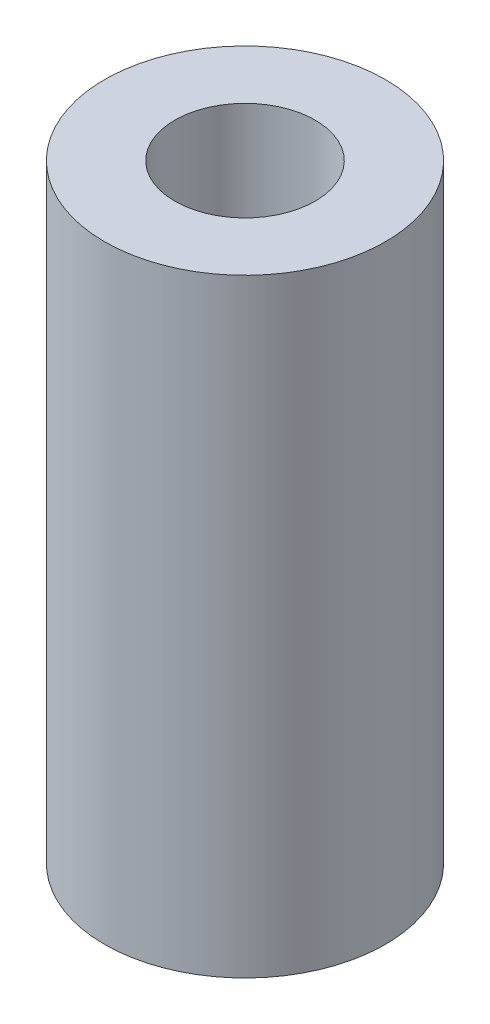
ISO-10303-21;
HEADER;
FILE_DESCRIPTION(('STEP AP214'),'2;1');
FILE_NAME('part.step','',(''),(''),'','','');
FILE_SCHEMA(('AUTOMOTIVE_DESIGN { 1 0 10303 214 1 1 1 1 }'));
ENDSEC;
DATA;
#1=APPLICATION_CONTEXT('core data for automotive mechanical design processes');
#2=APPLICATION_PROTOCOL_DEFINITION('international standard','automotive_design',2000,#1);
#3=PRODUCT_CONTEXT('',#1,'mechanical');
#4=PRODUCT('Part','Part','',(#3));
#5=PRODUCT_RELATED_PRODUCT_CATEGORY('part','',(#4));
#6=PRODUCT_DEFINITION_FORMATION('','',#4);
#7=PRODUCT_DEFINITION_CONTEXT('part definition',#1,'design');
#8=PRODUCT_DEFINITION('design','',#6,#7);
#9=PRODUCT_DEFINITION_SHAPE('','',#8);
#10=(LENGTH_UNIT() NAMED_UNIT(*) SI_UNIT(.MILLI.,.METRE.));
#11=(NAMED_UNIT(*) PLANE_ANGLE_UNIT() SI_UNIT($,.RADIAN.));
#12=(NAMED_UNIT(*) SI_UNIT($,.STERADIAN.) SOLID_ANGLE_UNIT());
#13=UNCERTAINTY_MEASURE_WITH_UNIT(LENGTH_MEASURE(1.E-05),#10,'distance_accuracy_value','');
#14=(GEOMETRIC_REPRESENTATION_CONTEXT(3) GLOBAL_UNCERTAINTY_ASSIGNED_CONTEXT((#13)) GLOBAL_UNIT_ASSIGNED_CONTEXT((#10,
#11,#12)) REPRESENTATION_CONTEXT('',''));
#15=CARTESIAN_POINT('',(0.,0.,0.));
#16=DIRECTION('',(0.,0.,1.));
#17=DIRECTION('',(1.,0.,0.));
#18=AXIS2_PLACEMENT_3D('',#15,#16,#17);
#19=CARTESIAN_POINT('',(0.,26.,0.));
#20=DIRECTION('',(0.,1.,0.));
#21=DIRECTION('',(0.,0.,1.));
#22=AXIS2_PLACEMENT_3D('',#19,#20,#21);
#23=PLANE('',#22);
#24=CARTESIAN_POINT('',(0.,26.,0.));
#25=DIRECTION('',(0.,1.,0.));
#26=DIRECTION('',(0.,0.,1.));
#27=AXIS2_PLACEMENT_3D('',#24,#25,#26);
#28=CIRCLE('',#27,6.);
#29=CARTESIAN_POINT('',(0.,26.,6.));
#30=VERTEX_POINT('',#29);
#31=EDGE_CURVE('E10',#30,#30,#28,.T.);
#32=ORIENTED_EDGE('',*,*,#31,.T.);
#33=EDGE_LOOP('',(#32));
#34=FACE_BOUND('',#33,.T.);
#35=CARTESIAN_POINT('',(0.,26.,0.));
#36=DIRECTION('',(0.,1.,0.));
#37=DIRECTION('',(0.,0.,1.));
#38=AXIS2_PLACEMENT_3D('',#35,#36,#37);
#39=CIRCLE('',#38,3.);
#40=CARTESIAN_POINT('',(0.,26.,3.));
#41=VERTEX_POINT('',#40);
#42=EDGE_CURVE('E43',#41,#41,#39,.T.);
#43=ORIENTED_EDGE('',*,*,#42,.F.);
#44=EDGE_LOOP('',(#43));
#45=FACE_BOUND('',#44,.T.);
#46=ADVANCED_FACE('F32',(#34,#45),#23,.T.);
#47=CARTESIAN_POINT('',(0.,0.,0.));
#48=DIRECTION('',(0.,1.,0.));
#49=DIRECTION('',(0.,0.,1.));
#50=AXIS2_PLACEMENT_3D('',#47,#48,#49);
#51=PLANE('',#50);
#52=CARTESIAN_POINT('',(0.,0.,0.));
#53=DIRECTION('',(0.,1.,0.));
#54=DIRECTION('',(0.,0.,1.));
#55=AXIS2_PLACEMENT_3D('',#52,#53,#54);
#56=CIRCLE('',#55,6.);
#57=CARTESIAN_POINT('',(0.,0.,6.));
#58=VERTEX_POINT('',#57);
#59=EDGE_CURVE('E36',#58,#58,#56,.T.);
#60=ORIENTED_EDGE('',*,*,#59,.F.);
#61=EDGE_LOOP('',(#60));
#62=FACE_BOUND('',#61,.T.);
#63=CARTESIAN_POINT('',(0.,0.,0.));
#64=DIRECTION('',(0.,1.,0.));
#65=DIRECTION('',(0.,0.,1.));
#66=AXIS2_PLACEMENT_3D('',#63,#64,#65);
#67=CIRCLE('',#66,3.);
#68=CARTESIAN_POINT('',(0.,0.,3.));
#69=VERTEX_POINT('',#68);
#70=EDGE_CURVE('E45',#69,#69,#67,.T.);
#71=ORIENTED_EDGE('',*,*,#70,.T.);
#72=EDGE_LOOP('',(#71));
#73=FACE_BOUND('',#72,.T.);
#74=ADVANCED_FACE('F55',(#62,#73),#51,.F.);
#75=CARTESIAN_POINT('',(0.,26.,0.));
#76=DIRECTION('',(0.,-1.,0.));
#77=DIRECTION('',(0.,0.,-1.));
#78=AXIS2_PLACEMENT_3D('',#75,#76,#77);
#79=CYLINDRICAL_SURFACE('',#78,6.);
#80=ORIENTED_EDGE('',*,*,#31,.F.);
#81=EDGE_LOOP('',(#80));
#82=FACE_BOUND('',#81,.T.);
#83=ORIENTED_EDGE('',*,*,#59,.T.);
#84=EDGE_LOOP('',(#83));
#85=FACE_BOUND('',#84,.T.);
#86=ADVANCED_FACE('F34',(#82,#85),#79,.T.);
#87=CARTESIAN_POINT('',(0.,26.,0.));
#88=DIRECTION('',(0.,-1.,0.));
#89=DIRECTION('',(0.,0.,-1.));
#90=AXIS2_PLACEMENT_3D('',#87,#88,#89);
#91=CYLINDRICAL_SURFACE('',#90,3.);
#92=ORIENTED_EDGE('',*,*,#42,.T.);
#93=EDGE_LOOP('',(#92));
#94=FACE_BOUND('',#93,.T.);
#95=ORIENTED_EDGE('',*,*,#70,.F.);
#96=EDGE_LOOP('',(#95));
#97=FACE_BOUND('',#96,.T.);
#98=ADVANCED_FACE('F51',(#94,#97),#91,.F.);
#99=CLOSED_SHELL('',(#46,#74,#86,#98));
#100=MANIFOLD_SOLID_BREP('B2',#99);
#101=ADVANCED_BREP_SHAPE_REPRESENTATION('',(#18,#100),#14);
#102=SHAPE_DEFINITION_REPRESENTATION(#9,#101);
ENDSEC;
END-ISO-10303-21;
